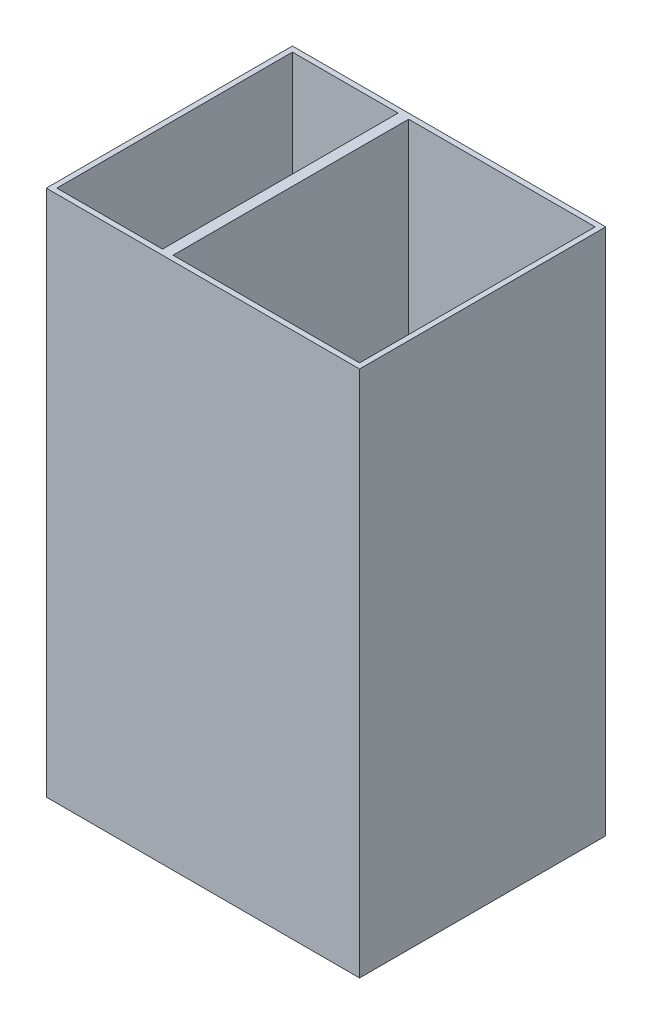
ISO-10303-21;
HEADER;
FILE_DESCRIPTION(('STEP AP214'),'2;1');
FILE_NAME('part.step','',(''),(''),'','','');
FILE_SCHEMA(('AUTOMOTIVE_DESIGN { 1 0 10303 214 1 1 1 1 }'));
ENDSEC;
DATA;
#1=APPLICATION_CONTEXT('core data for automotive mechanical design processes');
#2=APPLICATION_PROTOCOL_DEFINITION('international standard','automotive_design',2000,#1);
#3=PRODUCT_CONTEXT('',#1,'mechanical');
#4=PRODUCT('Part','Part','',(#3));
#5=PRODUCT_RELATED_PRODUCT_CATEGORY('part','',(#4));
#6=PRODUCT_DEFINITION_FORMATION('','',#4);
#7=PRODUCT_DEFINITION_CONTEXT('part definition',#1,'design');
#8=PRODUCT_DEFINITION('design','',#6,#7);
#9=PRODUCT_DEFINITION_SHAPE('','',#8);
#10=(LENGTH_UNIT() NAMED_UNIT(*) SI_UNIT(.MILLI.,.METRE.));
#11=(NAMED_UNIT(*) PLANE_ANGLE_UNIT() SI_UNIT($,.RADIAN.));
#12=(NAMED_UNIT(*) SI_UNIT($,.STERADIAN.) SOLID_ANGLE_UNIT());
#13=UNCERTAINTY_MEASURE_WITH_UNIT(LENGTH_MEASURE(1.E-05),#10,'distance_accuracy_value','');
#14=(GEOMETRIC_REPRESENTATION_CONTEXT(3) GLOBAL_UNCERTAINTY_ASSIGNED_CONTEXT((#13)) GLOBAL_UNIT_ASSIGNED_CONTEXT((#10,
#11,#12)) REPRESENTATION_CONTEXT('',''));
#15=CARTESIAN_POINT('',(0.,0.,0.));
#16=DIRECTION('',(0.,0.,1.));
#17=DIRECTION('',(1.,0.,0.));
#18=AXIS2_PLACEMENT_3D('',#15,#16,#17);
#19=CARTESIAN_POINT('',(0.,150.,0.));
#20=DIRECTION('',(0.,-1.,0.));
#21=DIRECTION('',(0.,0.,-1.));
#22=AXIS2_PLACEMENT_3D('',#19,#20,#21);
#23=PLANE('',#22);
#24=DIRECTION('',(-1.,0.,0.));
#25=VECTOR('',#24,1.);
#26=CARTESIAN_POINT('',(-10.,150.,-33.5));
#27=LINE('',#26,#25);
#28=CARTESIAN_POINT('',(43.05,150.,-33.5));
#29=VERTEX_POINT('',#28);
#30=CARTESIAN_POINT('',(-10.,150.,-33.5));
#31=VERTEX_POINT('',#30);
#32=EDGE_CURVE('E173',#29,#31,#27,.T.);
#33=ORIENTED_EDGE('',*,*,#32,.F.);
#34=DIRECTION('',(0.,0.,-1.));
#35=VECTOR('',#34,1.);
#36=CARTESIAN_POINT('',(43.05,150.,33.5));
#37=LINE('',#36,#35);
#38=CARTESIAN_POINT('',(43.05,150.,33.5));
#39=VERTEX_POINT('',#38);
#40=EDGE_CURVE('E181',#39,#29,#37,.T.);
#41=ORIENTED_EDGE('',*,*,#40,.F.);
#42=DIRECTION('',(1.,0.,0.));
#43=VECTOR('',#42,1.);
#44=CARTESIAN_POINT('',(-9.99999999999999,150.,33.5));
#45=LINE('',#44,#43);
#46=CARTESIAN_POINT('',(-9.99999999999999,150.,33.5));
#47=VERTEX_POINT('',#46);
#48=EDGE_CURVE('E178',#47,#39,#45,.T.);
#49=ORIENTED_EDGE('',*,*,#48,.F.);
#50=DIRECTION('',(0.,0.,1.));
#51=VECTOR('',#50,1.);
#52=CARTESIAN_POINT('',(-10.,150.,-33.5));
#53=LINE('',#52,#51);
#54=EDGE_CURVE('E175',#31,#47,#53,.T.);
#55=ORIENTED_EDGE('',*,*,#54,.F.);
#56=EDGE_LOOP('',(#33,#41,#49,#55));
#57=FACE_BOUND('',#56,.T.);
#58=DIRECTION('',(0.,0.,-1.));
#59=VECTOR('',#58,1.);
#60=CARTESIAN_POINT('',(44.55,150.,35.));
#61=LINE('',#60,#59);
#62=CARTESIAN_POINT('',(44.55,150.,35.));
#63=VERTEX_POINT('',#62);
#64=CARTESIAN_POINT('',(44.55,150.,-35.));
#65=VERTEX_POINT('',#64);
#66=EDGE_CURVE('E204',#63,#65,#61,.T.);
#67=ORIENTED_EDGE('',*,*,#66,.T.);
#68=DIRECTION('',(-1.,0.,0.));
#69=VECTOR('',#68,1.);
#70=CARTESIAN_POINT('',(-44.55,150.,-35.));
#71=LINE('',#70,#69);
#72=CARTESIAN_POINT('',(-44.55,150.,-35.));
#73=VERTEX_POINT('',#72);
#74=EDGE_CURVE('E207',#65,#73,#71,.T.);
#75=ORIENTED_EDGE('',*,*,#74,.T.);
#76=DIRECTION('',(0.,0.,1.));
#77=VECTOR('',#76,1.);
#78=CARTESIAN_POINT('',(-44.55,150.,35.));
#79=LINE('',#78,#77);
#80=CARTESIAN_POINT('',(-44.55,150.,35.));
#81=VERTEX_POINT('',#80);
#82=EDGE_CURVE('E210',#73,#81,#79,.T.);
#83=ORIENTED_EDGE('',*,*,#82,.T.);
#84=DIRECTION('',(1.,0.,0.));
#85=VECTOR('',#84,1.);
#86=CARTESIAN_POINT('',(-44.55,150.,35.));
#87=LINE('',#86,#85);
#88=EDGE_CURVE('E212',#81,#63,#87,.T.);
#89=ORIENTED_EDGE('',*,*,#88,.T.);
#90=EDGE_LOOP('',(#67,#75,#83,#89));
#91=FACE_BOUND('',#90,.T.);
#92=DIRECTION('',(0.,0.,1.));
#93=VECTOR('',#92,1.);
#94=CARTESIAN_POINT('',(-43.05,150.,33.5));
#95=LINE('',#94,#93);
#96=CARTESIAN_POINT('',(-43.05,150.,-33.5));
#97=VERTEX_POINT('',#96);
#98=CARTESIAN_POINT('',(-43.05,150.,33.5));
#99=VERTEX_POINT('',#98);
#100=EDGE_CURVE('E135',#97,#99,#95,.T.);
#101=ORIENTED_EDGE('',*,*,#100,.F.);
#102=DIRECTION('',(-1.,0.,0.));
#103=VECTOR('',#102,1.);
#104=CARTESIAN_POINT('',(-43.05,150.,-33.5));
#105=LINE('',#104,#103);
#106=CARTESIAN_POINT('',(-13.,150.,-33.5));
#107=VERTEX_POINT('',#106);
#108=EDGE_CURVE('E157',#107,#97,#105,.T.);
#109=ORIENTED_EDGE('',*,*,#108,.F.);
#110=DIRECTION('',(0.,0.,-1.));
#111=VECTOR('',#110,1.);
#112=CARTESIAN_POINT('',(-13.,150.,-33.5));
#113=LINE('',#112,#111);
#114=CARTESIAN_POINT('',(-13.,150.,33.5));
#115=VERTEX_POINT('',#114);
#116=EDGE_CURVE('E155',#115,#107,#113,.T.);
#117=ORIENTED_EDGE('',*,*,#116,.F.);
#118=DIRECTION('',(1.,0.,0.));
#119=VECTOR('',#118,1.);
#120=CARTESIAN_POINT('',(-43.05,150.,33.5));
#121=LINE('',#120,#119);
#122=EDGE_CURVE('E143',#99,#115,#121,.T.);
#123=ORIENTED_EDGE('',*,*,#122,.F.);
#124=EDGE_LOOP('',(#101,#109,#117,#123));
#125=FACE_BOUND('',#124,.T.);
#126=ADVANCED_FACE('F46',(#57,#91,#125),#23,.F.);
#127=CARTESIAN_POINT('',(0.,0.,0.));
#128=DIRECTION('',(0.,-1.,0.));
#129=DIRECTION('',(0.,0.,-1.));
#130=AXIS2_PLACEMENT_3D('',#127,#128,#129);
#131=PLANE('',#130);
#132=DIRECTION('',(0.,0.,-1.));
#133=VECTOR('',#132,1.);
#134=CARTESIAN_POINT('',(44.55,0.,35.));
#135=LINE('',#134,#133);
#136=CARTESIAN_POINT('',(44.55,0.,35.));
#137=VERTEX_POINT('',#136);
#138=CARTESIAN_POINT('',(44.55,0.,-35.));
#139=VERTEX_POINT('',#138);
#140=EDGE_CURVE('E203',#137,#139,#135,.T.);
#141=ORIENTED_EDGE('',*,*,#140,.F.);
#142=DIRECTION('',(1.,0.,0.));
#143=VECTOR('',#142,1.);
#144=CARTESIAN_POINT('',(-44.55,0.,35.));
#145=LINE('',#144,#143);
#146=CARTESIAN_POINT('',(-44.55,0.,35.));
#147=VERTEX_POINT('',#146);
#148=EDGE_CURVE('E208',#147,#137,#145,.T.);
#149=ORIENTED_EDGE('',*,*,#148,.F.);
#150=DIRECTION('',(0.,0.,1.));
#151=VECTOR('',#150,1.);
#152=CARTESIAN_POINT('',(-44.55,0.,35.));
#153=LINE('',#152,#151);
#154=CARTESIAN_POINT('',(-44.55,0.,-35.));
#155=VERTEX_POINT('',#154);
#156=EDGE_CURVE('E219',#155,#147,#153,.T.);
#157=ORIENTED_EDGE('',*,*,#156,.F.);
#158=DIRECTION('',(-1.,0.,0.));
#159=VECTOR('',#158,1.);
#160=CARTESIAN_POINT('',(-44.55,0.,-35.));
#161=LINE('',#160,#159);
#162=EDGE_CURVE('E217',#139,#155,#161,.T.);
#163=ORIENTED_EDGE('',*,*,#162,.F.);
#164=EDGE_LOOP('',(#141,#149,#157,#163));
#165=FACE_BOUND('',#164,.T.);
#166=DIRECTION('',(0.,0.,-1.));
#167=VECTOR('',#166,1.);
#168=CARTESIAN_POINT('',(43.05,0.,33.5));
#169=LINE('',#168,#167);
#170=CARTESIAN_POINT('',(43.05,0.,33.5));
#171=VERTEX_POINT('',#170);
#172=CARTESIAN_POINT('',(43.05,0.,-33.5));
#173=VERTEX_POINT('',#172);
#174=EDGE_CURVE('E176',#171,#173,#169,.T.);
#175=ORIENTED_EDGE('',*,*,#174,.T.);
#176=DIRECTION('',(-1.,0.,0.));
#177=VECTOR('',#176,1.);
#178=CARTESIAN_POINT('',(-10.,0.,-33.5));
#179=LINE('',#178,#177);
#180=CARTESIAN_POINT('',(-10.,0.,-33.5));
#181=VERTEX_POINT('',#180);
#182=EDGE_CURVE('E151',#173,#181,#179,.T.);
#183=ORIENTED_EDGE('',*,*,#182,.T.);
#184=DIRECTION('',(0.,0.,1.));
#185=VECTOR('',#184,1.);
#186=CARTESIAN_POINT('',(-10.,0.,-33.5));
#187=LINE('',#186,#185);
#188=CARTESIAN_POINT('',(-9.99999999999999,0.,33.5));
#189=VERTEX_POINT('',#188);
#190=EDGE_CURVE('E186',#181,#189,#187,.T.);
#191=ORIENTED_EDGE('',*,*,#190,.T.);
#192=DIRECTION('',(1.,0.,0.));
#193=VECTOR('',#192,1.);
#194=CARTESIAN_POINT('',(-9.99999999999999,0.,33.5));
#195=LINE('',#194,#193);
#196=EDGE_CURVE('E189',#189,#171,#195,.T.);
#197=ORIENTED_EDGE('',*,*,#196,.T.);
#198=EDGE_LOOP('',(#175,#183,#191,#197));
#199=FACE_BOUND('',#198,.T.);
#200=DIRECTION('',(-1.,0.,0.));
#201=VECTOR('',#200,1.);
#202=CARTESIAN_POINT('',(-43.05,0.,-33.5));
#203=LINE('',#202,#201);
#204=CARTESIAN_POINT('',(-13.,0.,-33.5));
#205=VERTEX_POINT('',#204);
#206=CARTESIAN_POINT('',(-43.05,0.,-33.5));
#207=VERTEX_POINT('',#206);
#208=EDGE_CURVE('E144',#205,#207,#203,.T.);
#209=ORIENTED_EDGE('',*,*,#208,.T.);
#210=DIRECTION('',(0.,0.,1.));
#211=VECTOR('',#210,1.);
#212=CARTESIAN_POINT('',(-43.05,0.,33.5));
#213=LINE('',#212,#211);
#214=CARTESIAN_POINT('',(-43.05,0.,33.5));
#215=VERTEX_POINT('',#214);
#216=EDGE_CURVE('E69',#207,#215,#213,.T.);
#217=ORIENTED_EDGE('',*,*,#216,.T.);
#218=DIRECTION('',(1.,0.,0.));
#219=VECTOR('',#218,1.);
#220=CARTESIAN_POINT('',(-43.05,0.,33.5));
#221=LINE('',#220,#219);
#222=CARTESIAN_POINT('',(-13.,0.,33.5));
#223=VERTEX_POINT('',#222);
#224=EDGE_CURVE('E150',#215,#223,#221,.T.);
#225=ORIENTED_EDGE('',*,*,#224,.T.);
#226=DIRECTION('',(0.,0.,-1.));
#227=VECTOR('',#226,1.);
#228=CARTESIAN_POINT('',(-13.,0.,-33.5));
#229=LINE('',#228,#227);
#230=EDGE_CURVE('E165',#223,#205,#229,.T.);
#231=ORIENTED_EDGE('',*,*,#230,.T.);
#232=EDGE_LOOP('',(#209,#217,#225,#231));
#233=FACE_BOUND('',#232,.T.);
#234=ADVANCED_FACE('F237',(#165,#199,#233),#131,.T.);
#235=CARTESIAN_POINT('',(44.55,150.,35.));
#236=DIRECTION('',(-1.,0.,0.));
#237=DIRECTION('',(0.,0.,1.));
#238=AXIS2_PLACEMENT_3D('',#235,#236,#237);
#239=PLANE('',#238);
#240=ORIENTED_EDGE('',*,*,#140,.T.);
#241=DIRECTION('',(0.,-1.,0.));
#242=VECTOR('',#241,1.);
#243=CARTESIAN_POINT('',(44.55,150.,-35.));
#244=LINE('',#243,#242);
#245=EDGE_CURVE('E13',#65,#139,#244,.T.);
#246=ORIENTED_EDGE('',*,*,#245,.F.);
#247=ORIENTED_EDGE('',*,*,#66,.F.);
#248=DIRECTION('',(0.,-1.,0.));
#249=VECTOR('',#248,1.);
#250=CARTESIAN_POINT('',(44.55,150.,35.));
#251=LINE('',#250,#249);
#252=EDGE_CURVE('E214',#63,#137,#251,.T.);
#253=ORIENTED_EDGE('',*,*,#252,.T.);
#254=EDGE_LOOP('',(#240,#246,#247,#253));
#255=FACE_BOUND('',#254,.T.);
#256=ADVANCED_FACE('F48',(#255),#239,.F.);
#257=CARTESIAN_POINT('',(-44.55,150.,-35.));
#258=DIRECTION('',(0.,0.,1.));
#259=DIRECTION('',(1.,0.,0.));
#260=AXIS2_PLACEMENT_3D('',#257,#258,#259);
#261=PLANE('',#260);
#262=ORIENTED_EDGE('',*,*,#162,.T.);
#263=DIRECTION('',(0.,-1.,0.));
#264=VECTOR('',#263,1.);
#265=CARTESIAN_POINT('',(-44.55,150.,-35.));
#266=LINE('',#265,#264);
#267=EDGE_CURVE('E54',#73,#155,#266,.T.);
#268=ORIENTED_EDGE('',*,*,#267,.F.);
#269=ORIENTED_EDGE('',*,*,#74,.F.);
#270=ORIENTED_EDGE('',*,*,#245,.T.);
#271=EDGE_LOOP('',(#262,#268,#269,#270));
#272=FACE_BOUND('',#271,.T.);
#273=ADVANCED_FACE('F247',(#272),#261,.F.);
#274=CARTESIAN_POINT('',(-44.55,150.,35.));
#275=DIRECTION('',(1.,0.,0.));
#276=DIRECTION('',(0.,0.,-1.));
#277=AXIS2_PLACEMENT_3D('',#274,#275,#276);
#278=PLANE('',#277);
#279=ORIENTED_EDGE('',*,*,#156,.T.);
#280=DIRECTION('',(0.,-1.,0.));
#281=VECTOR('',#280,1.);
#282=CARTESIAN_POINT('',(-44.55,150.,35.));
#283=LINE('',#282,#281);
#284=EDGE_CURVE('E224',#81,#147,#283,.T.);
#285=ORIENTED_EDGE('',*,*,#284,.F.);
#286=ORIENTED_EDGE('',*,*,#82,.F.);
#287=ORIENTED_EDGE('',*,*,#267,.T.);
#288=EDGE_LOOP('',(#279,#285,#286,#287));
#289=FACE_BOUND('',#288,.T.);
#290=ADVANCED_FACE('F231',(#289),#278,.F.);
#291=CARTESIAN_POINT('',(-44.55,150.,35.));
#292=DIRECTION('',(0.,0.,-1.));
#293=DIRECTION('',(-1.,0.,0.));
#294=AXIS2_PLACEMENT_3D('',#291,#292,#293);
#295=PLANE('',#294);
#296=ORIENTED_EDGE('',*,*,#148,.T.);
#297=ORIENTED_EDGE('',*,*,#252,.F.);
#298=ORIENTED_EDGE('',*,*,#88,.F.);
#299=ORIENTED_EDGE('',*,*,#284,.T.);
#300=EDGE_LOOP('',(#296,#297,#298,#299));
#301=FACE_BOUND('',#300,.T.);
#302=ADVANCED_FACE('F241',(#301),#295,.F.);
#303=CARTESIAN_POINT('',(-10.,150.,-33.5));
#304=DIRECTION('',(0.,0.,1.));
#305=DIRECTION('',(1.,0.,0.));
#306=AXIS2_PLACEMENT_3D('',#303,#304,#305);
#307=PLANE('',#306);
#308=ORIENTED_EDGE('',*,*,#182,.F.);
#309=DIRECTION('',(0.,-1.,0.));
#310=VECTOR('',#309,1.);
#311=CARTESIAN_POINT('',(43.05,150.,-33.5));
#312=LINE('',#311,#310);
#313=EDGE_CURVE('E183',#29,#173,#312,.T.);
#314=ORIENTED_EDGE('',*,*,#313,.F.);
#315=ORIENTED_EDGE('',*,*,#32,.T.);
#316=DIRECTION('',(0.,-1.,0.));
#317=VECTOR('',#316,1.);
#318=CARTESIAN_POINT('',(-10.,150.,-33.5));
#319=LINE('',#318,#317);
#320=EDGE_CURVE('E200',#31,#181,#319,.T.);
#321=ORIENTED_EDGE('',*,*,#320,.T.);
#322=EDGE_LOOP('',(#308,#314,#315,#321));
#323=FACE_BOUND('',#322,.T.);
#324=ADVANCED_FACE('F263',(#323),#307,.T.);
#325=CARTESIAN_POINT('',(-10.,150.,-33.5));
#326=DIRECTION('',(1.,0.,0.));
#327=DIRECTION('',(0.,0.,-1.));
#328=AXIS2_PLACEMENT_3D('',#325,#326,#327);
#329=PLANE('',#328);
#330=CARTESIAN_POINT('',(-9.99999999999999,75.0345511142585,17.5));
#331=DIRECTION('',(1.,0.,0.));
#332=DIRECTION('',(0.,0.,-1.));
#333=AXIS2_PLACEMENT_3D('',#330,#331,#332);
#334=CIRCLE('',#333,2.);
#335=CARTESIAN_POINT('',(-9.99999999999999,75.0345511142585,15.5));
#336=VERTEX_POINT('',#335);
#337=EDGE_CURVE('E326',#336,#336,#334,.T.);
#338=ORIENTED_EDGE('',*,*,#337,.F.);
#339=EDGE_LOOP('',(#338));
#340=FACE_BOUND('',#339,.T.);
#341=CARTESIAN_POINT('',(-10.,75.0345511142585,-17.5));
#342=DIRECTION('',(1.,0.,0.));
#343=DIRECTION('',(0.,0.,-1.));
#344=AXIS2_PLACEMENT_3D('',#341,#342,#343);
#345=CIRCLE('',#344,2.);
#346=CARTESIAN_POINT('',(-10.,75.0345511142585,-19.5));
#347=VERTEX_POINT('',#346);
#348=EDGE_CURVE('E331',#347,#347,#345,.T.);
#349=ORIENTED_EDGE('',*,*,#348,.F.);
#350=EDGE_LOOP('',(#349));
#351=FACE_BOUND('',#350,.T.);
#352=CARTESIAN_POINT('',(-10.,83.0345511142585,0.));
#353=DIRECTION('',(1.,0.,0.));
#354=DIRECTION('',(0.,0.,-1.));
#355=AXIS2_PLACEMENT_3D('',#352,#353,#354);
#356=CIRCLE('',#355,4.525);
#357=CARTESIAN_POINT('',(-10.,83.0345511142585,-4.525));
#358=VERTEX_POINT('',#357);
#359=EDGE_CURVE('E338',#358,#358,#356,.T.);
#360=ORIENTED_EDGE('',*,*,#359,.F.);
#361=EDGE_LOOP('',(#360));
#362=FACE_BOUND('',#361,.T.);
#363=ORIENTED_EDGE('',*,*,#190,.F.);
#364=ORIENTED_EDGE('',*,*,#320,.F.);
#365=ORIENTED_EDGE('',*,*,#54,.T.);
#366=DIRECTION('',(0.,-1.,0.));
#367=VECTOR('',#366,1.);
#368=CARTESIAN_POINT('',(-9.99999999999999,150.,33.5));
#369=LINE('',#368,#367);
#370=EDGE_CURVE('E198',#47,#189,#369,.T.);
#371=ORIENTED_EDGE('',*,*,#370,.T.);
#372=EDGE_LOOP('',(#363,#364,#365,#371));
#373=FACE_BOUND('',#372,.T.);
#374=ADVANCED_FACE('F270',(#340,#351,#362,#373),#329,.T.);
#375=CARTESIAN_POINT('',(-9.99999999999999,150.,33.5));
#376=DIRECTION('',(0.,0.,-1.));
#377=DIRECTION('',(-1.,0.,0.));
#378=AXIS2_PLACEMENT_3D('',#375,#376,#377);
#379=PLANE('',#378);
#380=ORIENTED_EDGE('',*,*,#196,.F.);
#381=ORIENTED_EDGE('',*,*,#370,.F.);
#382=ORIENTED_EDGE('',*,*,#48,.T.);
#383=DIRECTION('',(0.,-1.,0.));
#384=VECTOR('',#383,1.);
#385=CARTESIAN_POINT('',(43.05,150.,33.5));
#386=LINE('',#385,#384);
#387=EDGE_CURVE('E196',#39,#171,#386,.T.);
#388=ORIENTED_EDGE('',*,*,#387,.T.);
#389=EDGE_LOOP('',(#380,#381,#382,#388));
#390=FACE_BOUND('',#389,.T.);
#391=ADVANCED_FACE('F275',(#390),#379,.T.);
#392=CARTESIAN_POINT('',(43.05,150.,33.5));
#393=DIRECTION('',(-1.,0.,0.));
#394=DIRECTION('',(0.,0.,1.));
#395=AXIS2_PLACEMENT_3D('',#392,#393,#394);
#396=PLANE('',#395);
#397=ORIENTED_EDGE('',*,*,#174,.F.);
#398=ORIENTED_EDGE('',*,*,#387,.F.);
#399=ORIENTED_EDGE('',*,*,#40,.T.);
#400=ORIENTED_EDGE('',*,*,#313,.T.);
#401=EDGE_LOOP('',(#397,#398,#399,#400));
#402=FACE_BOUND('',#401,.T.);
#403=ADVANCED_FACE('F281',(#402),#396,.T.);
#404=CARTESIAN_POINT('',(-43.05,150.,33.5));
#405=DIRECTION('',(1.,0.,0.));
#406=DIRECTION('',(0.,0.,-1.));
#407=AXIS2_PLACEMENT_3D('',#404,#405,#406);
#408=PLANE('',#407);
#409=ORIENTED_EDGE('',*,*,#216,.F.);
#410=DIRECTION('',(0.,-1.,0.));
#411=VECTOR('',#410,1.);
#412=CARTESIAN_POINT('',(-43.05,150.,-33.5));
#413=LINE('',#412,#411);
#414=EDGE_CURVE('E139',#97,#207,#413,.T.);
#415=ORIENTED_EDGE('',*,*,#414,.F.);
#416=ORIENTED_EDGE('',*,*,#100,.T.);
#417=DIRECTION('',(0.,-1.,0.));
#418=VECTOR('',#417,1.);
#419=CARTESIAN_POINT('',(-43.05,150.,33.5));
#420=LINE('',#419,#418);
#421=EDGE_CURVE('E138',#99,#215,#420,.T.);
#422=ORIENTED_EDGE('',*,*,#421,.T.);
#423=EDGE_LOOP('',(#409,#415,#416,#422));
#424=FACE_BOUND('',#423,.T.);
#425=ADVANCED_FACE('F137',(#424),#408,.T.);
#426=CARTESIAN_POINT('',(-43.05,150.,33.5));
#427=DIRECTION('',(0.,0.,-1.));
#428=DIRECTION('',(-1.,0.,0.));
#429=AXIS2_PLACEMENT_3D('',#426,#427,#428);
#430=PLANE('',#429);
#431=ORIENTED_EDGE('',*,*,#224,.F.);
#432=ORIENTED_EDGE('',*,*,#421,.F.);
#433=ORIENTED_EDGE('',*,*,#122,.T.);
#434=DIRECTION('',(0.,-1.,0.));
#435=VECTOR('',#434,1.);
#436=CARTESIAN_POINT('',(-13.,150.,33.5));
#437=LINE('',#436,#435);
#438=EDGE_CURVE('E152',#115,#223,#437,.T.);
#439=ORIENTED_EDGE('',*,*,#438,.T.);
#440=EDGE_LOOP('',(#431,#432,#433,#439));
#441=FACE_BOUND('',#440,.T.);
#442=ADVANCED_FACE('F147',(#441),#430,.T.);
#443=CARTESIAN_POINT('',(-13.,150.,-33.5));
#444=DIRECTION('',(-1.,0.,0.));
#445=DIRECTION('',(0.,0.,1.));
#446=AXIS2_PLACEMENT_3D('',#443,#444,#445);
#447=PLANE('',#446);
#448=CARTESIAN_POINT('',(-13.,75.0345511142585,17.5));
#449=DIRECTION('',(1.,0.,0.));
#450=DIRECTION('',(0.,0.,-1.));
#451=AXIS2_PLACEMENT_3D('',#448,#449,#450);
#452=CIRCLE('',#451,2.);
#453=CARTESIAN_POINT('',(-13.,75.0345511142585,15.5));
#454=VERTEX_POINT('',#453);
#455=EDGE_CURVE('E163',#454,#454,#452,.T.);
#456=ORIENTED_EDGE('',*,*,#455,.T.);
#457=EDGE_LOOP('',(#456));
#458=FACE_BOUND('',#457,.T.);
#459=CARTESIAN_POINT('',(-13.,75.0345511142585,-17.5));
#460=DIRECTION('',(1.,0.,0.));
#461=DIRECTION('',(0.,0.,-1.));
#462=AXIS2_PLACEMENT_3D('',#459,#460,#461);
#463=CIRCLE('',#462,2.);
#464=CARTESIAN_POINT('',(-13.,75.0345511142585,-19.5));
#465=VERTEX_POINT('',#464);
#466=EDGE_CURVE('E327',#465,#465,#463,.T.);
#467=ORIENTED_EDGE('',*,*,#466,.T.);
#468=EDGE_LOOP('',(#467));
#469=FACE_BOUND('',#468,.T.);
#470=CARTESIAN_POINT('',(-13.,83.0345511142585,0.));
#471=DIRECTION('',(1.,0.,0.));
#472=DIRECTION('',(0.,0.,-1.));
#473=AXIS2_PLACEMENT_3D('',#470,#471,#472);
#474=CIRCLE('',#473,4.525);
#475=CARTESIAN_POINT('',(-13.,83.0345511142585,-4.525));
#476=VERTEX_POINT('',#475);
#477=EDGE_CURVE('E336',#476,#476,#474,.T.);
#478=ORIENTED_EDGE('',*,*,#477,.T.);
#479=EDGE_LOOP('',(#478));
#480=FACE_BOUND('',#479,.T.);
#481=ORIENTED_EDGE('',*,*,#230,.F.);
#482=ORIENTED_EDGE('',*,*,#438,.F.);
#483=ORIENTED_EDGE('',*,*,#116,.T.);
#484=DIRECTION('',(0.,-1.,0.));
#485=VECTOR('',#484,1.);
#486=CARTESIAN_POINT('',(-13.,150.,-33.5));
#487=LINE('',#486,#485);
#488=EDGE_CURVE('E61',#107,#205,#487,.T.);
#489=ORIENTED_EDGE('',*,*,#488,.T.);
#490=EDGE_LOOP('',(#481,#482,#483,#489));
#491=FACE_BOUND('',#490,.T.);
#492=ADVANCED_FACE('F301',(#458,#469,#480,#491),#447,.T.);
#493=CARTESIAN_POINT('',(-43.05,150.,-33.5));
#494=DIRECTION('',(0.,0.,1.));
#495=DIRECTION('',(1.,0.,0.));
#496=AXIS2_PLACEMENT_3D('',#493,#494,#495);
#497=PLANE('',#496);
#498=ORIENTED_EDGE('',*,*,#208,.F.);
#499=ORIENTED_EDGE('',*,*,#488,.F.);
#500=ORIENTED_EDGE('',*,*,#108,.T.);
#501=ORIENTED_EDGE('',*,*,#414,.T.);
#502=EDGE_LOOP('',(#498,#499,#500,#501));
#503=FACE_BOUND('',#502,.T.);
#504=ADVANCED_FACE('F304',(#503),#497,.T.);
#505=CARTESIAN_POINT('',(-13.,83.0345511142585,0.));
#506=DIRECTION('',(1.,0.,0.));
#507=DIRECTION('',(0.,0.,-1.));
#508=AXIS2_PLACEMENT_3D('',#505,#506,#507);
#509=CYLINDRICAL_SURFACE('',#508,4.525);
#510=ORIENTED_EDGE('',*,*,#477,.F.);
#511=EDGE_LOOP('',(#510));
#512=FACE_BOUND('',#511,.T.);
#513=ORIENTED_EDGE('',*,*,#359,.T.);
#514=EDGE_LOOP('',(#513));
#515=FACE_BOUND('',#514,.T.);
#516=ADVANCED_FACE('F308',(#512,#515),#509,.F.);
#517=CARTESIAN_POINT('',(-13.,75.0345511142585,-17.5));
#518=DIRECTION('',(1.,0.,0.));
#519=DIRECTION('',(0.,0.,-1.));
#520=AXIS2_PLACEMENT_3D('',#517,#518,#519);
#521=CYLINDRICAL_SURFACE('',#520,2.);
#522=ORIENTED_EDGE('',*,*,#466,.F.);
#523=EDGE_LOOP('',(#522));
#524=FACE_BOUND('',#523,.T.);
#525=ORIENTED_EDGE('',*,*,#348,.T.);
#526=EDGE_LOOP('',(#525));
#527=FACE_BOUND('',#526,.T.);
#528=ADVANCED_FACE('F311',(#524,#527),#521,.F.);
#529=CARTESIAN_POINT('',(-13.,75.0345511142585,17.5));
#530=DIRECTION('',(1.,0.,0.));
#531=DIRECTION('',(0.,0.,-1.));
#532=AXIS2_PLACEMENT_3D('',#529,#530,#531);
#533=CYLINDRICAL_SURFACE('',#532,2.);
#534=ORIENTED_EDGE('',*,*,#455,.F.);
#535=EDGE_LOOP('',(#534));
#536=FACE_BOUND('',#535,.T.);
#537=ORIENTED_EDGE('',*,*,#337,.T.);
#538=EDGE_LOOP('',(#537));
#539=FACE_BOUND('',#538,.T.);
#540=ADVANCED_FACE('F315',(#536,#539),#533,.F.);
#541=CLOSED_SHELL('',(#126,#234,#256,#273,#290,#302,#324,#374,#391,#403,#425,#442,#492,#504,
#516,#528,#540));
#542=MANIFOLD_SOLID_BREP('B2',#541);
#543=ADVANCED_BREP_SHAPE_REPRESENTATION('',(#18,#542),#14);
#544=SHAPE_DEFINITION_REPRESENTATION(#9,#543);
ENDSEC;
END-ISO-10303-21;
